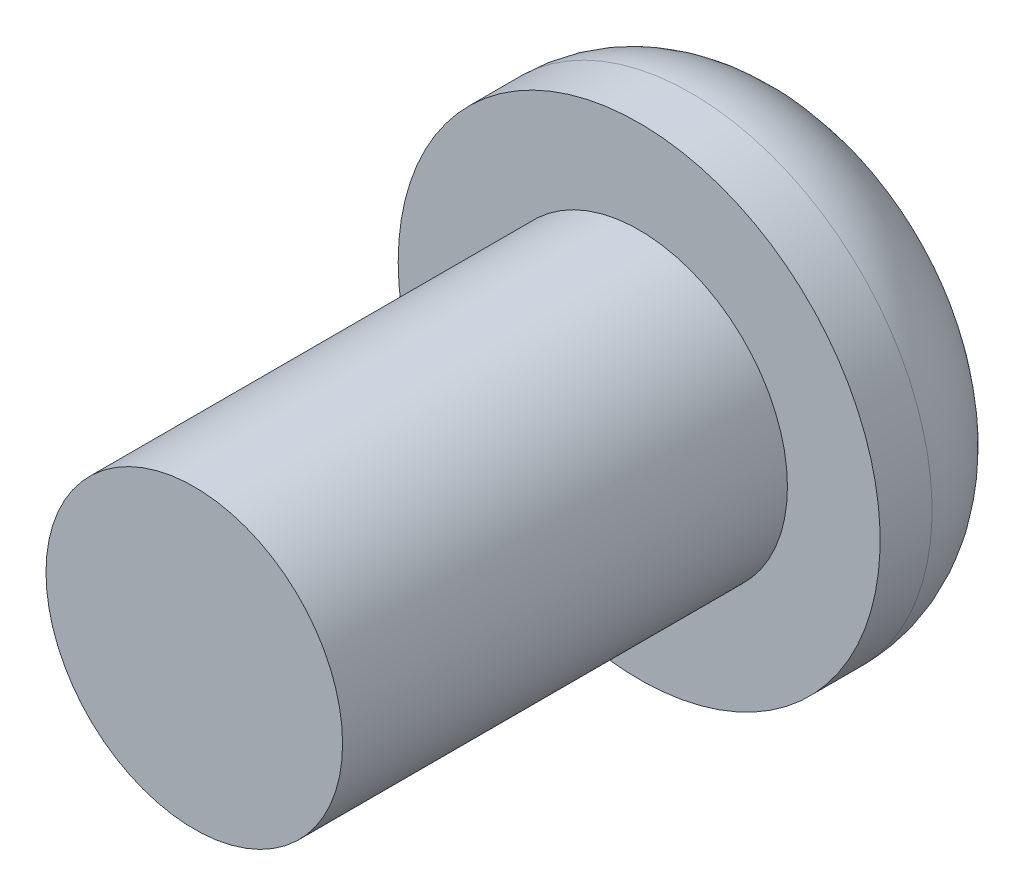
ISO-10303-21;
HEADER;
FILE_DESCRIPTION(('STEP AP214'),'2;1');
FILE_NAME('part.step','',(''),(''),'','','');
FILE_SCHEMA(('AUTOMOTIVE_DESIGN { 1 0 10303 214 1 1 1 1 }'));
ENDSEC;
DATA;
#1=APPLICATION_CONTEXT('core data for automotive mechanical design processes');
#2=APPLICATION_PROTOCOL_DEFINITION('international standard','automotive_design',2000,#1);
#3=PRODUCT_CONTEXT('',#1,'mechanical');
#4=PRODUCT('Part','Part','',(#3));
#5=PRODUCT_RELATED_PRODUCT_CATEGORY('part','',(#4));
#6=PRODUCT_DEFINITION_FORMATION('','',#4);
#7=PRODUCT_DEFINITION_CONTEXT('part definition',#1,'design');
#8=PRODUCT_DEFINITION('design','',#6,#7);
#9=PRODUCT_DEFINITION_SHAPE('','',#8);
#10=(LENGTH_UNIT() NAMED_UNIT(*) SI_UNIT(.MILLI.,.METRE.));
#11=(NAMED_UNIT(*) PLANE_ANGLE_UNIT() SI_UNIT($,.RADIAN.));
#12=(NAMED_UNIT(*) SI_UNIT($,.STERADIAN.) SOLID_ANGLE_UNIT());
#13=UNCERTAINTY_MEASURE_WITH_UNIT(LENGTH_MEASURE(1.E-05),#10,'distance_accuracy_value','');
#14=(GEOMETRIC_REPRESENTATION_CONTEXT(3) GLOBAL_UNCERTAINTY_ASSIGNED_CONTEXT((#13)) GLOBAL_UNIT_ASSIGNED_CONTEXT((#10,
#11,#12)) REPRESENTATION_CONTEXT('',''));
#15=CARTESIAN_POINT('',(0.,0.,0.));
#16=DIRECTION('',(0.,0.,1.));
#17=DIRECTION('',(1.,0.,0.));
#18=AXIS2_PLACEMENT_3D('',#15,#16,#17);
#19=CARTESIAN_POINT('',(0.,0.,6.));
#20=DIRECTION('',(0.,0.,-1.));
#21=DIRECTION('',(-1.,0.,0.));
#22=AXIS2_PLACEMENT_3D('',#19,#20,#21);
#23=CYLINDRICAL_SURFACE('',#22,2.);
#24=CARTESIAN_POINT('',(0.,0.,6.));
#25=DIRECTION('',(0.,0.,1.));
#26=DIRECTION('',(1.,0.,0.));
#27=AXIS2_PLACEMENT_3D('',#24,#25,#26);
#28=CIRCLE('',#27,2.);
#29=CARTESIAN_POINT('',(2.,0.,6.));
#30=VERTEX_POINT('',#29);
#31=EDGE_CURVE('E44',#30,#30,#28,.T.);
#32=ORIENTED_EDGE('',*,*,#31,.F.);
#33=EDGE_LOOP('',(#32));
#34=FACE_BOUND('',#33,.T.);
#35=CARTESIAN_POINT('',(0.,0.,0.));
#36=DIRECTION('',(0.,0.,1.));
#37=DIRECTION('',(1.,0.,0.));
#38=AXIS2_PLACEMENT_3D('',#35,#36,#37);
#39=CIRCLE('',#38,2.);
#40=CARTESIAN_POINT('',(2.,0.,0.));
#41=VERTEX_POINT('',#40);
#42=EDGE_CURVE('E48',#41,#41,#39,.T.);
#43=ORIENTED_EDGE('',*,*,#42,.T.);
#44=EDGE_LOOP('',(#43));
#45=FACE_BOUND('',#44,.T.);
#46=ADVANCED_FACE('F33',(#34,#45),#23,.T.);
#47=CARTESIAN_POINT('',(0.,0.,6.));
#48=DIRECTION('',(0.,0.,1.));
#49=DIRECTION('',(1.,0.,0.));
#50=AXIS2_PLACEMENT_3D('',#47,#48,#49);
#51=PLANE('',#50);
#52=ORIENTED_EDGE('',*,*,#31,.T.);
#53=EDGE_LOOP('',(#52));
#54=FACE_BOUND('',#53,.T.);
#55=ADVANCED_FACE('F73',(#54),#51,.T.);
#56=CARTESIAN_POINT('',(0.,0.,-2.2));
#57=DIRECTION('',(0.,0.,1.));
#58=DIRECTION('',(1.,0.,0.));
#59=AXIS2_PLACEMENT_3D('',#56,#57,#58);
#60=CYLINDRICAL_SURFACE('',#59,3.25);
#61=CARTESIAN_POINT('',(0.,0.,-0.7));
#62=DIRECTION('',(0.,0.,-1.));
#63=DIRECTION('',(-1.,0.,0.));
#64=AXIS2_PLACEMENT_3D('',#61,#62,#63);
#65=CIRCLE('',#64,3.25);
#66=CARTESIAN_POINT('',(-3.25,0.,-0.7));
#67=VERTEX_POINT('',#66);
#68=EDGE_CURVE('E10',#67,#67,#65,.F.);
#69=ORIENTED_EDGE('',*,*,#68,.T.);
#70=EDGE_LOOP('',(#69));
#71=FACE_BOUND('',#70,.T.);
#72=CARTESIAN_POINT('',(0.,0.,0.));
#73=DIRECTION('',(0.,0.,-1.));
#74=DIRECTION('',(-1.,0.,0.));
#75=AXIS2_PLACEMENT_3D('',#72,#73,#74);
#76=CIRCLE('',#75,3.25);
#77=CARTESIAN_POINT('',(-3.25,0.,0.));
#78=VERTEX_POINT('',#77);
#79=EDGE_CURVE('E52',#78,#78,#76,.T.);
#80=ORIENTED_EDGE('',*,*,#79,.T.);
#81=EDGE_LOOP('',(#80));
#82=FACE_BOUND('',#81,.T.);
#83=ADVANCED_FACE('F57',(#71,#82),#60,.T.);
#84=CARTESIAN_POINT('',(0.,0.,-2.2));
#85=DIRECTION('',(0.,0.,-1.));
#86=DIRECTION('',(-1.,0.,0.));
#87=AXIS2_PLACEMENT_3D('',#84,#85,#86);
#88=PLANE('',#87);
#89=CARTESIAN_POINT('',(0.,0.,-2.2));
#90=DIRECTION('',(0.,0.,-1.));
#91=DIRECTION('',(-1.,0.,0.));
#92=AXIS2_PLACEMENT_3D('',#89,#90,#91);
#93=CIRCLE('',#92,1.75);
#94=CARTESIAN_POINT('',(-1.75,0.,-2.2));
#95=VERTEX_POINT('',#94);
#96=EDGE_CURVE('E40',#95,#95,#93,.T.);
#97=ORIENTED_EDGE('',*,*,#96,.T.);
#98=EDGE_LOOP('',(#97));
#99=FACE_BOUND('',#98,.T.);
#100=ADVANCED_FACE('F61',(#99),#88,.T.);
#101=CARTESIAN_POINT('',(0.,0.,0.));
#102=DIRECTION('',(0.,0.,-1.));
#103=DIRECTION('',(-1.,0.,0.));
#104=AXIS2_PLACEMENT_3D('',#101,#102,#103);
#105=PLANE('',#104);
#106=ORIENTED_EDGE('',*,*,#42,.F.);
#107=EDGE_LOOP('',(#106));
#108=FACE_BOUND('',#107,.T.);
#109=ORIENTED_EDGE('',*,*,#79,.F.);
#110=EDGE_LOOP('',(#109));
#111=FACE_BOUND('',#110,.T.);
#112=ADVANCED_FACE('F59',(#108,#111),#105,.F.);
#113=CARTESIAN_POINT('',(0.,0.,-0.7));
#114=DIRECTION('',(0.,0.,-1.));
#115=DIRECTION('',(-1.,0.,0.));
#116=AXIS2_PLACEMENT_3D('',#113,#114,#115);
#117=TOROIDAL_SURFACE('',#116,1.75,1.5);
#118=ORIENTED_EDGE('',*,*,#68,.F.);
#119=EDGE_LOOP('',(#118));
#120=FACE_BOUND('',#119,.T.);
#121=ORIENTED_EDGE('',*,*,#96,.F.);
#122=EDGE_LOOP('',(#121));
#123=FACE_BOUND('',#122,.T.);
#124=ADVANCED_FACE('F35',(#120,#123),#117,.T.);
#125=CLOSED_SHELL('',(#46,#55,#83,#100,#112,#124));
#126=MANIFOLD_SOLID_BREP('B2',#125);
#127=ADVANCED_BREP_SHAPE_REPRESENTATION('',(#18,#126),#14);
#128=SHAPE_DEFINITION_REPRESENTATION(#9,#127);
ENDSEC;
END-ISO-10303-21;
